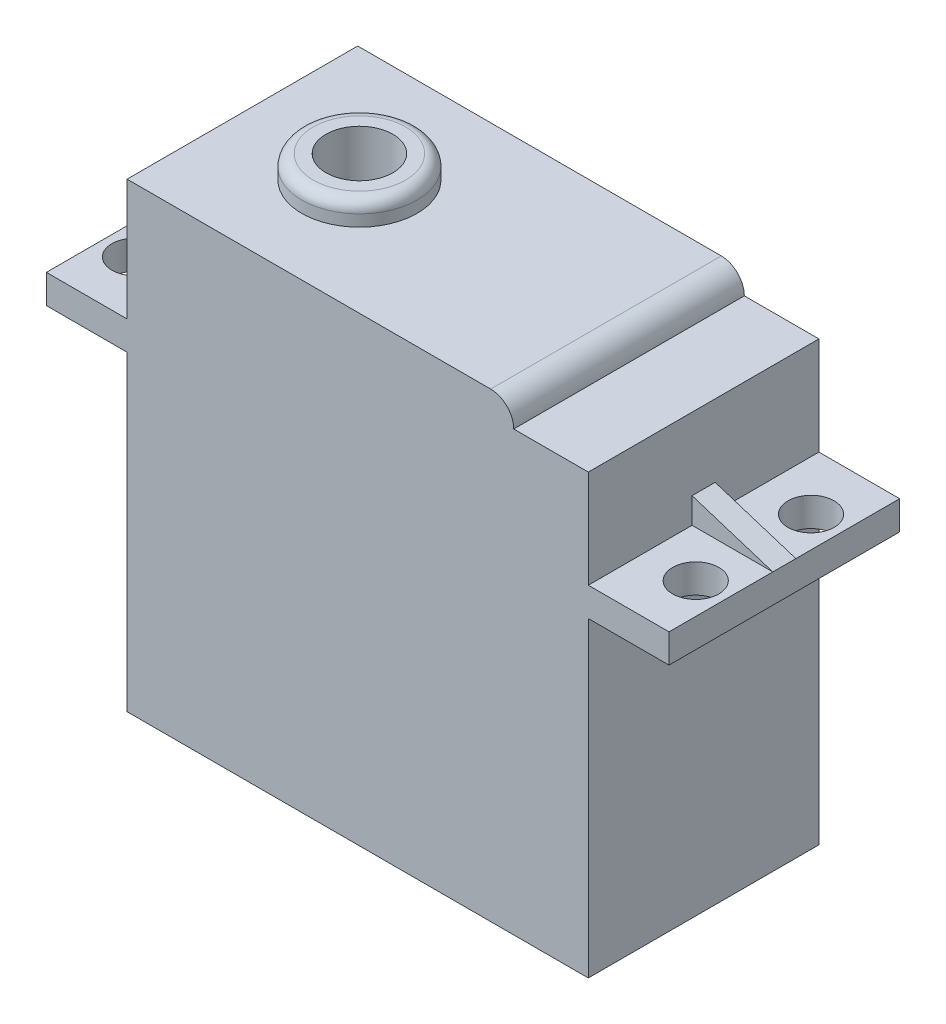
ISO-10303-21;
HEADER;
FILE_DESCRIPTION(('STEP AP214'),'2;1');
FILE_NAME('part.step','',(''),(''),'','','');
FILE_SCHEMA(('AUTOMOTIVE_DESIGN { 1 0 10303 214 1 1 1 1 }'));
ENDSEC;
DATA;
#1=APPLICATION_CONTEXT('core data for automotive mechanical design processes');
#2=APPLICATION_PROTOCOL_DEFINITION('international standard','automotive_design',2000,#1);
#3=PRODUCT_CONTEXT('',#1,'mechanical');
#4=PRODUCT('Part','Part','',(#3));
#5=PRODUCT_RELATED_PRODUCT_CATEGORY('part','',(#4));
#6=PRODUCT_DEFINITION_FORMATION('','',#4);
#7=PRODUCT_DEFINITION_CONTEXT('part definition',#1,'design');
#8=PRODUCT_DEFINITION('design','',#6,#7);
#9=PRODUCT_DEFINITION_SHAPE('','',#8);
#10=(LENGTH_UNIT() NAMED_UNIT(*) SI_UNIT(.MILLI.,.METRE.));
#11=(NAMED_UNIT(*) PLANE_ANGLE_UNIT() SI_UNIT($,.RADIAN.));
#12=(NAMED_UNIT(*) SI_UNIT($,.STERADIAN.) SOLID_ANGLE_UNIT());
#13=UNCERTAINTY_MEASURE_WITH_UNIT(LENGTH_MEASURE(1.E-05),#10,'distance_accuracy_value','');
#14=(GEOMETRIC_REPRESENTATION_CONTEXT(3) GLOBAL_UNCERTAINTY_ASSIGNED_CONTEXT((#13)) GLOBAL_UNIT_ASSIGNED_CONTEXT((#10,
#11,#12)) REPRESENTATION_CONTEXT('',''));
#15=CARTESIAN_POINT('',(0.,0.,0.));
#16=DIRECTION('',(0.,0.,1.));
#17=DIRECTION('',(1.,0.,0.));
#18=AXIS2_PLACEMENT_3D('',#15,#16,#17);
#19=CARTESIAN_POINT('',(0.,2.5,0.));
#20=DIRECTION('',(0.,-1.,0.));
#21=DIRECTION('',(0.,0.,-1.));
#22=AXIS2_PLACEMENT_3D('',#19,#20,#21);
#23=PLANE('',#22);
#24=CARTESIAN_POINT('',(24.315,2.5,-5.));
#25=DIRECTION('',(0.,1.,0.));
#26=DIRECTION('',(0.,0.,1.));
#27=AXIS2_PLACEMENT_3D('',#24,#25,#26);
#28=CIRCLE('',#27,2.);
#29=CARTESIAN_POINT('',(24.315,2.5,-3.));
#30=VERTEX_POINT('',#29);
#31=EDGE_CURVE('E264',#30,#30,#28,.T.);
#32=ORIENTED_EDGE('',*,*,#31,.F.);
#33=EDGE_LOOP('',(#32));
#34=FACE_BOUND('',#33,.T.);
#35=DIRECTION('',(-1.,0.,0.));
#36=VECTOR('',#35,1.);
#37=CARTESIAN_POINT('',(0.,2.5,-1.));
#38=LINE('',#37,#36);
#39=CARTESIAN_POINT('',(27.,2.5,-0.999999999999999));
#40=VERTEX_POINT('',#39);
#41=CARTESIAN_POINT('',(20.,2.5,-0.999999999999999));
#42=VERTEX_POINT('',#41);
#43=EDGE_CURVE('E53',#40,#42,#38,.T.);
#44=ORIENTED_EDGE('',*,*,#43,.F.);
#45=DIRECTION('',(0.,0.,-1.));
#46=VECTOR('',#45,1.);
#47=CARTESIAN_POINT('',(27.,2.5,-10.));
#48=LINE('',#47,#46);
#49=CARTESIAN_POINT('',(27.,2.5,-10.));
#50=VERTEX_POINT('',#49);
#51=EDGE_CURVE('E300',#40,#50,#48,.T.);
#52=ORIENTED_EDGE('',*,*,#51,.T.);
#53=DIRECTION('',(-1.,0.,0.));
#54=VECTOR('',#53,1.);
#55=CARTESIAN_POINT('',(-27.,2.5,-10.));
#56=LINE('',#55,#54);
#57=CARTESIAN_POINT('',(20.,2.5,-10.));
#58=VERTEX_POINT('',#57);
#59=EDGE_CURVE('E288',#50,#58,#56,.T.);
#60=ORIENTED_EDGE('',*,*,#59,.T.);
#61=DIRECTION('',(0.,0.,-1.));
#62=VECTOR('',#61,1.);
#63=CARTESIAN_POINT('',(20.,2.5,10.));
#64=LINE('',#63,#62);
#65=EDGE_CURVE('E250',#42,#58,#64,.T.);
#66=ORIENTED_EDGE('',*,*,#65,.F.);
#67=EDGE_LOOP('',(#44,#52,#60,#66));
#68=FACE_BOUND('',#67,.T.);
#69=ADVANCED_FACE('F38',(#34,#68),#23,.F.);
#70=CARTESIAN_POINT('',(-24.315,2.5,-5.));
#71=DIRECTION('',(0.,1.,0.));
#72=DIRECTION('',(0.,0.,-1.));
#73=AXIS2_PLACEMENT_3D('',#70,#71,#72);
#74=CIRCLE('',#73,2.);
#75=CARTESIAN_POINT('',(-24.315,2.5,-7.));
#76=VERTEX_POINT('',#75);
#77=EDGE_CURVE('E276',#76,#76,#74,.T.);
#78=ORIENTED_EDGE('',*,*,#77,.F.);
#79=EDGE_LOOP('',(#78));
#80=FACE_BOUND('',#79,.T.);
#81=DIRECTION('',(-1.,0.,0.));
#82=VECTOR('',#81,1.);
#83=CARTESIAN_POINT('',(0.,2.5,-1.));
#84=LINE('',#83,#82);
#85=CARTESIAN_POINT('',(-20.,2.5,-1.));
#86=VERTEX_POINT('',#85);
#87=CARTESIAN_POINT('',(-27.,2.5,-0.999999999999999));
#88=VERTEX_POINT('',#87);
#89=EDGE_CURVE('E206',#86,#88,#84,.T.);
#90=ORIENTED_EDGE('',*,*,#89,.F.);
#91=DIRECTION('',(0.,0.,1.));
#92=VECTOR('',#91,1.);
#93=CARTESIAN_POINT('',(-20.,2.5,-10.));
#94=LINE('',#93,#92);
#95=CARTESIAN_POINT('',(-20.,2.5,-10.));
#96=VERTEX_POINT('',#95);
#97=EDGE_CURVE('E248',#96,#86,#94,.T.);
#98=ORIENTED_EDGE('',*,*,#97,.F.);
#99=CARTESIAN_POINT('',(-27.,2.5,-10.));
#100=VERTEX_POINT('',#99);
#101=EDGE_CURVE('E292',#96,#100,#56,.T.);
#102=ORIENTED_EDGE('',*,*,#101,.T.);
#103=DIRECTION('',(0.,0.,1.));
#104=VECTOR('',#103,1.);
#105=CARTESIAN_POINT('',(-27.,2.5,10.));
#106=LINE('',#105,#104);
#107=EDGE_CURVE('E293',#100,#88,#106,.T.);
#108=ORIENTED_EDGE('',*,*,#107,.T.);
#109=EDGE_LOOP('',(#90,#98,#102,#108));
#110=FACE_BOUND('',#109,.T.);
#111=ADVANCED_FACE('F385',(#80,#110),#23,.F.);
#112=CARTESIAN_POINT('',(24.315,2.5,5.));
#113=DIRECTION('',(0.,1.,0.));
#114=DIRECTION('',(0.,0.,-1.));
#115=AXIS2_PLACEMENT_3D('',#112,#113,#114);
#116=CIRCLE('',#115,2.);
#117=CARTESIAN_POINT('',(24.315,2.5,3.));
#118=VERTEX_POINT('',#117);
#119=EDGE_CURVE('E270',#118,#118,#116,.T.);
#120=ORIENTED_EDGE('',*,*,#119,.F.);
#121=EDGE_LOOP('',(#120));
#122=FACE_BOUND('',#121,.T.);
#123=CARTESIAN_POINT('',(27.,2.5,10.));
#124=VERTEX_POINT('',#123);
#125=CARTESIAN_POINT('',(27.,2.5,0.999999999999999));
#126=VERTEX_POINT('',#125);
#127=EDGE_CURVE('E301',#124,#126,#48,.T.);
#128=ORIENTED_EDGE('',*,*,#127,.T.);
#129=DIRECTION('',(-1.,0.,0.));
#130=VECTOR('',#129,1.);
#131=CARTESIAN_POINT('',(0.,2.5,1.));
#132=LINE('',#131,#130);
#133=CARTESIAN_POINT('',(20.,2.5,0.999999999999999));
#134=VERTEX_POINT('',#133);
#135=EDGE_CURVE('E61',#126,#134,#132,.T.);
#136=ORIENTED_EDGE('',*,*,#135,.T.);
#137=CARTESIAN_POINT('',(20.,2.5,10.));
#138=VERTEX_POINT('',#137);
#139=EDGE_CURVE('E243',#138,#134,#64,.T.);
#140=ORIENTED_EDGE('',*,*,#139,.F.);
#141=DIRECTION('',(1.,0.,0.));
#142=VECTOR('',#141,1.);
#143=CARTESIAN_POINT('',(27.,2.5,10.));
#144=LINE('',#143,#142);
#145=EDGE_CURVE('E296',#138,#124,#144,.T.);
#146=ORIENTED_EDGE('',*,*,#145,.T.);
#147=EDGE_LOOP('',(#128,#136,#140,#146));
#148=FACE_BOUND('',#147,.T.);
#149=ADVANCED_FACE('F388',(#122,#148),#23,.F.);
#150=CARTESIAN_POINT('',(-24.315,2.5,5.));
#151=DIRECTION('',(0.,1.,0.));
#152=DIRECTION('',(0.,0.,1.));
#153=AXIS2_PLACEMENT_3D('',#150,#151,#152);
#154=CIRCLE('',#153,2.);
#155=CARTESIAN_POINT('',(-24.315,2.5,7.));
#156=VERTEX_POINT('',#155);
#157=EDGE_CURVE('E282',#156,#156,#154,.T.);
#158=ORIENTED_EDGE('',*,*,#157,.F.);
#159=EDGE_LOOP('',(#158));
#160=FACE_BOUND('',#159,.T.);
#161=CARTESIAN_POINT('',(-20.,2.5,0.999999999999999));
#162=VERTEX_POINT('',#161);
#163=CARTESIAN_POINT('',(-20.,2.5,10.));
#164=VERTEX_POINT('',#163);
#165=EDGE_CURVE('E237',#162,#164,#94,.T.);
#166=ORIENTED_EDGE('',*,*,#165,.F.);
#167=DIRECTION('',(-1.,0.,0.));
#168=VECTOR('',#167,1.);
#169=CARTESIAN_POINT('',(0.,2.5,1.));
#170=LINE('',#169,#168);
#171=CARTESIAN_POINT('',(-27.,2.5,0.999999999999999));
#172=VERTEX_POINT('',#171);
#173=EDGE_CURVE('E214',#162,#172,#170,.T.);
#174=ORIENTED_EDGE('',*,*,#173,.T.);
#175=CARTESIAN_POINT('',(-27.,2.5,10.));
#176=VERTEX_POINT('',#175);
#177=EDGE_CURVE('E291',#172,#176,#106,.T.);
#178=ORIENTED_EDGE('',*,*,#177,.T.);
#179=EDGE_CURVE('E297',#176,#164,#144,.T.);
#180=ORIENTED_EDGE('',*,*,#179,.T.);
#181=EDGE_LOOP('',(#166,#174,#178,#180));
#182=FACE_BOUND('',#181,.T.);
#183=ADVANCED_FACE('F393',(#160,#182),#23,.F.);
#184=CARTESIAN_POINT('',(0.,-27.,10.));
#185=DIRECTION('',(0.,0.,1.));
#186=DIRECTION('',(1.,0.,0.));
#187=AXIS2_PLACEMENT_3D('',#184,#185,#186);
#188=PLANE('',#187);
#189=DIRECTION('',(1.,0.,0.));
#190=VECTOR('',#189,1.);
#191=CARTESIAN_POINT('',(-20.,11.,10.));
#192=LINE('',#191,#190);
#193=CARTESIAN_POINT('',(13.5311118888266,11.,10.));
#194=VERTEX_POINT('',#193);
#195=CARTESIAN_POINT('',(20.,11.,10.));
#196=VERTEX_POINT('',#195);
#197=EDGE_CURVE('E242',#194,#196,#192,.T.);
#198=ORIENTED_EDGE('',*,*,#197,.F.);
#199=CARTESIAN_POINT('',(11.5311118888266,11.,10.));
#200=DIRECTION('',(0.,0.,1.));
#201=DIRECTION('',(1.,0.,0.));
#202=AXIS2_PLACEMENT_3D('',#199,#200,#201);
#203=CIRCLE('',#202,2.);
#204=CARTESIAN_POINT('',(11.5311118888266,13.,10.));
#205=VERTEX_POINT('',#204);
#206=EDGE_CURVE('E356',#194,#205,#203,.T.);
#207=ORIENTED_EDGE('',*,*,#206,.T.);
#208=DIRECTION('',(1.,0.,0.));
#209=VECTOR('',#208,1.);
#210=CARTESIAN_POINT('',(13.5311118888266,13.,10.));
#211=LINE('',#210,#209);
#212=CARTESIAN_POINT('',(-20.,13.,10.));
#213=VERTEX_POINT('',#212);
#214=EDGE_CURVE('E232',#213,#205,#211,.T.);
#215=ORIENTED_EDGE('',*,*,#214,.F.);
#216=DIRECTION('',(0.,-1.,0.));
#217=VECTOR('',#216,1.);
#218=CARTESIAN_POINT('',(-20.,11.,10.));
#219=LINE('',#218,#217);
#220=EDGE_CURVE('E257',#213,#164,#219,.T.);
#221=ORIENTED_EDGE('',*,*,#220,.T.);
#222=ORIENTED_EDGE('',*,*,#179,.F.);
#223=DIRECTION('',(0.,-1.,0.));
#224=VECTOR('',#223,1.);
#225=CARTESIAN_POINT('',(-27.,2.5,10.));
#226=LINE('',#225,#224);
#227=CARTESIAN_POINT('',(-27.,0.,10.));
#228=VERTEX_POINT('',#227);
#229=EDGE_CURVE('E321',#176,#228,#226,.T.);
#230=ORIENTED_EDGE('',*,*,#229,.T.);
#231=DIRECTION('',(1.,0.,0.));
#232=VECTOR('',#231,1.);
#233=CARTESIAN_POINT('',(27.,0.,10.));
#234=LINE('',#233,#232);
#235=CARTESIAN_POINT('',(-20.,0.,10.));
#236=VERTEX_POINT('',#235);
#237=EDGE_CURVE('E307',#228,#236,#234,.T.);
#238=ORIENTED_EDGE('',*,*,#237,.T.);
#239=DIRECTION('',(0.,1.,0.));
#240=VECTOR('',#239,1.);
#241=CARTESIAN_POINT('',(-20.,-27.,10.));
#242=LINE('',#241,#240);
#243=CARTESIAN_POINT('',(-20.,-27.,10.));
#244=VERTEX_POINT('',#243);
#245=EDGE_CURVE('E342',#244,#236,#242,.T.);
#246=ORIENTED_EDGE('',*,*,#245,.F.);
#247=DIRECTION('',(1.,0.,0.));
#248=VECTOR('',#247,1.);
#249=CARTESIAN_POINT('',(20.,-27.,10.));
#250=LINE('',#249,#248);
#251=CARTESIAN_POINT('',(20.,-27.,10.));
#252=VERTEX_POINT('',#251);
#253=EDGE_CURVE('E328',#244,#252,#250,.T.);
#254=ORIENTED_EDGE('',*,*,#253,.T.);
#255=DIRECTION('',(0.,1.,0.));
#256=VECTOR('',#255,1.);
#257=CARTESIAN_POINT('',(20.,-27.,10.));
#258=LINE('',#257,#256);
#259=CARTESIAN_POINT('',(20.,0.,10.));
#260=VERTEX_POINT('',#259);
#261=EDGE_CURVE('E339',#252,#260,#258,.T.);
#262=ORIENTED_EDGE('',*,*,#261,.T.);
#263=CARTESIAN_POINT('',(27.,0.,10.));
#264=VERTEX_POINT('',#263);
#265=EDGE_CURVE('E306',#260,#264,#234,.T.);
#266=ORIENTED_EDGE('',*,*,#265,.T.);
#267=DIRECTION('',(0.,-1.,0.));
#268=VECTOR('',#267,1.);
#269=CARTESIAN_POINT('',(27.,2.5,10.));
#270=LINE('',#269,#268);
#271=EDGE_CURVE('E318',#124,#264,#270,.T.);
#272=ORIENTED_EDGE('',*,*,#271,.F.);
#273=ORIENTED_EDGE('',*,*,#145,.F.);
#274=DIRECTION('',(0.,-1.,0.));
#275=VECTOR('',#274,1.);
#276=CARTESIAN_POINT('',(20.,11.,10.));
#277=LINE('',#276,#275);
#278=EDGE_CURVE('E254',#196,#138,#277,.T.);
#279=ORIENTED_EDGE('',*,*,#278,.F.);
#280=EDGE_LOOP('',(#198,#207,#215,#221,#222,#230,#238,#246,#254,#262,#266,#272,#273,#279));
#281=FACE_BOUND('',#280,.T.);
#282=ADVANCED_FACE('F402',(#281),#188,.T.);
#283=CARTESIAN_POINT('',(-20.,-27.,10.));
#284=DIRECTION('',(-1.,0.,0.));
#285=DIRECTION('',(0.,0.,1.));
#286=AXIS2_PLACEMENT_3D('',#283,#284,#285);
#287=PLANE('',#286);
#288=ORIENTED_EDGE('',*,*,#245,.T.);
#289=DIRECTION('',(0.,0.,1.));
#290=VECTOR('',#289,1.);
#291=CARTESIAN_POINT('',(-20.,0.,10.));
#292=LINE('',#291,#290);
#293=CARTESIAN_POINT('',(-20.,0.,-10.));
#294=VERTEX_POINT('',#293);
#295=EDGE_CURVE('E332',#294,#236,#292,.T.);
#296=ORIENTED_EDGE('',*,*,#295,.F.);
#297=DIRECTION('',(0.,1.,0.));
#298=VECTOR('',#297,1.);
#299=CARTESIAN_POINT('',(-20.,-27.,-10.));
#300=LINE('',#299,#298);
#301=CARTESIAN_POINT('',(-20.,-27.,-10.));
#302=VERTEX_POINT('',#301);
#303=EDGE_CURVE('E346',#302,#294,#300,.T.);
#304=ORIENTED_EDGE('',*,*,#303,.F.);
#305=DIRECTION('',(0.,0.,1.));
#306=VECTOR('',#305,1.);
#307=CARTESIAN_POINT('',(-20.,-27.,10.));
#308=LINE('',#307,#306);
#309=EDGE_CURVE('E337',#302,#244,#308,.T.);
#310=ORIENTED_EDGE('',*,*,#309,.T.);
#311=EDGE_LOOP('',(#288,#296,#304,#310));
#312=FACE_BOUND('',#311,.T.);
#313=ADVANCED_FACE('F551',(#312),#287,.T.);
#314=CARTESIAN_POINT('',(-20.,-27.,-10.));
#315=DIRECTION('',(0.,0.,-1.));
#316=DIRECTION('',(-1.,0.,0.));
#317=AXIS2_PLACEMENT_3D('',#314,#315,#316);
#318=PLANE('',#317);
#319=DIRECTION('',(-1.,0.,0.));
#320=VECTOR('',#319,1.);
#321=CARTESIAN_POINT('',(-20.,13.,-10.));
#322=LINE('',#321,#320);
#323=CARTESIAN_POINT('',(11.5311118888266,13.,-10.));
#324=VERTEX_POINT('',#323);
#325=CARTESIAN_POINT('',(-20.,13.,-10.));
#326=VERTEX_POINT('',#325);
#327=EDGE_CURVE('E235',#324,#326,#322,.T.);
#328=ORIENTED_EDGE('',*,*,#327,.F.);
#329=CARTESIAN_POINT('',(11.5311118888266,11.,-10.));
#330=DIRECTION('',(0.,0.,-1.));
#331=DIRECTION('',(-1.,0.,0.));
#332=AXIS2_PLACEMENT_3D('',#329,#330,#331);
#333=CIRCLE('',#332,2.);
#334=CARTESIAN_POINT('',(13.5311118888266,11.,-10.));
#335=VERTEX_POINT('',#334);
#336=EDGE_CURVE('E353',#324,#335,#333,.T.);
#337=ORIENTED_EDGE('',*,*,#336,.T.);
#338=DIRECTION('',(-1.,0.,0.));
#339=VECTOR('',#338,1.);
#340=CARTESIAN_POINT('',(20.,11.,-10.));
#341=LINE('',#340,#339);
#342=CARTESIAN_POINT('',(20.,11.,-10.));
#343=VERTEX_POINT('',#342);
#344=EDGE_CURVE('E239',#343,#335,#341,.T.);
#345=ORIENTED_EDGE('',*,*,#344,.F.);
#346=DIRECTION('',(0.,-1.,0.));
#347=VECTOR('',#346,1.);
#348=CARTESIAN_POINT('',(20.,11.,-10.));
#349=LINE('',#348,#347);
#350=EDGE_CURVE('E247',#343,#58,#349,.T.);
#351=ORIENTED_EDGE('',*,*,#350,.T.);
#352=ORIENTED_EDGE('',*,*,#59,.F.);
#353=DIRECTION('',(0.,-1.,0.));
#354=VECTOR('',#353,1.);
#355=CARTESIAN_POINT('',(27.,2.5,-10.));
#356=LINE('',#355,#354);
#357=CARTESIAN_POINT('',(27.,0.,-10.));
#358=VERTEX_POINT('',#357);
#359=EDGE_CURVE('E304',#50,#358,#356,.T.);
#360=ORIENTED_EDGE('',*,*,#359,.T.);
#361=DIRECTION('',(-1.,0.,0.));
#362=VECTOR('',#361,1.);
#363=CARTESIAN_POINT('',(0.,0.,-10.));
#364=LINE('',#363,#362);
#365=CARTESIAN_POINT('',(20.,0.,-10.));
#366=VERTEX_POINT('',#365);
#367=EDGE_CURVE('E313',#358,#366,#364,.T.);
#368=ORIENTED_EDGE('',*,*,#367,.T.);
#369=DIRECTION('',(0.,1.,0.));
#370=VECTOR('',#369,1.);
#371=CARTESIAN_POINT('',(20.,-27.,-10.));
#372=LINE('',#371,#370);
#373=CARTESIAN_POINT('',(20.,-27.,-10.));
#374=VERTEX_POINT('',#373);
#375=EDGE_CURVE('E348',#374,#366,#372,.T.);
#376=ORIENTED_EDGE('',*,*,#375,.F.);
#377=DIRECTION('',(-1.,0.,0.));
#378=VECTOR('',#377,1.);
#379=CARTESIAN_POINT('',(-20.,-27.,-10.));
#380=LINE('',#379,#378);
#381=EDGE_CURVE('E334',#374,#302,#380,.T.);
#382=ORIENTED_EDGE('',*,*,#381,.T.);
#383=ORIENTED_EDGE('',*,*,#303,.T.);
#384=CARTESIAN_POINT('',(-27.,0.,-10.));
#385=VERTEX_POINT('',#384);
#386=EDGE_CURVE('E312',#294,#385,#364,.T.);
#387=ORIENTED_EDGE('',*,*,#386,.T.);
#388=DIRECTION('',(0.,-1.,0.));
#389=VECTOR('',#388,1.);
#390=CARTESIAN_POINT('',(-27.,2.5,-10.));
#391=LINE('',#390,#389);
#392=EDGE_CURVE('E324',#100,#385,#391,.T.);
#393=ORIENTED_EDGE('',*,*,#392,.F.);
#394=ORIENTED_EDGE('',*,*,#101,.F.);
#395=DIRECTION('',(0.,-1.,0.));
#396=VECTOR('',#395,1.);
#397=CARTESIAN_POINT('',(-20.,11.,-10.));
#398=LINE('',#397,#396);
#399=EDGE_CURVE('E260',#326,#96,#398,.T.);
#400=ORIENTED_EDGE('',*,*,#399,.F.);
#401=EDGE_LOOP('',(#328,#337,#345,#351,#352,#360,#368,#376,#382,#383,#387,#393,#394,#400));
#402=FACE_BOUND('',#401,.T.);
#403=ADVANCED_FACE('F545',(#402),#318,.T.);
#404=CARTESIAN_POINT('',(20.,-27.,-10.));
#405=DIRECTION('',(1.,0.,0.));
#406=DIRECTION('',(0.,0.,-1.));
#407=AXIS2_PLACEMENT_3D('',#404,#405,#406);
#408=PLANE('',#407);
#409=DIRECTION('',(0.,0.,-1.));
#410=VECTOR('',#409,1.);
#411=CARTESIAN_POINT('',(20.,-27.,-10.));
#412=LINE('',#411,#410);
#413=EDGE_CURVE('E331',#252,#374,#412,.T.);
#414=ORIENTED_EDGE('',*,*,#413,.T.);
#415=ORIENTED_EDGE('',*,*,#375,.T.);
#416=DIRECTION('',(0.,0.,-1.));
#417=VECTOR('',#416,1.);
#418=CARTESIAN_POINT('',(20.,0.,-10.));
#419=LINE('',#418,#417);
#420=EDGE_CURVE('E327',#260,#366,#419,.T.);
#421=ORIENTED_EDGE('',*,*,#420,.F.);
#422=ORIENTED_EDGE('',*,*,#261,.F.);
#423=EDGE_LOOP('',(#414,#415,#421,#422));
#424=FACE_BOUND('',#423,.T.);
#425=ADVANCED_FACE('F550',(#424),#408,.T.);
#426=CARTESIAN_POINT('',(0.,-27.,0.));
#427=DIRECTION('',(0.,-1.,0.));
#428=DIRECTION('',(0.,0.,-1.));
#429=AXIS2_PLACEMENT_3D('',#426,#427,#428);
#430=PLANE('',#429);
#431=ORIENTED_EDGE('',*,*,#253,.F.);
#432=ORIENTED_EDGE('',*,*,#309,.F.);
#433=ORIENTED_EDGE('',*,*,#381,.F.);
#434=ORIENTED_EDGE('',*,*,#413,.F.);
#435=EDGE_LOOP('',(#431,#432,#433,#434));
#436=FACE_BOUND('',#435,.T.);
#437=ADVANCED_FACE('F643',(#436),#430,.T.);
#438=CARTESIAN_POINT('',(0.,0.,0.));
#439=DIRECTION('',(0.,-1.,0.));
#440=DIRECTION('',(0.,0.,-1.));
#441=AXIS2_PLACEMENT_3D('',#438,#439,#440);
#442=PLANE('',#441);
#443=ORIENTED_EDGE('',*,*,#367,.F.);
#444=DIRECTION('',(0.,0.,-1.));
#445=VECTOR('',#444,1.);
#446=CARTESIAN_POINT('',(27.,0.,-10.));
#447=LINE('',#446,#445);
#448=EDGE_CURVE('E310',#264,#358,#447,.T.);
#449=ORIENTED_EDGE('',*,*,#448,.F.);
#450=ORIENTED_EDGE('',*,*,#265,.F.);
#451=ORIENTED_EDGE('',*,*,#420,.T.);
#452=EDGE_LOOP('',(#443,#449,#450,#451));
#453=FACE_BOUND('',#452,.T.);
#454=CARTESIAN_POINT('',(24.315,0.,5.));
#455=DIRECTION('',(0.,1.,0.));
#456=DIRECTION('',(0.,0.,-1.));
#457=AXIS2_PLACEMENT_3D('',#454,#455,#456);
#458=CIRCLE('',#457,2.);
#459=CARTESIAN_POINT('',(24.315,0.,3.));
#460=VERTEX_POINT('',#459);
#461=EDGE_CURVE('E267',#460,#460,#458,.T.);
#462=ORIENTED_EDGE('',*,*,#461,.T.);
#463=EDGE_LOOP('',(#462));
#464=FACE_BOUND('',#463,.T.);
#465=CARTESIAN_POINT('',(24.315,0.,-5.));
#466=DIRECTION('',(0.,1.,0.));
#467=DIRECTION('',(0.,0.,1.));
#468=AXIS2_PLACEMENT_3D('',#465,#466,#467);
#469=CIRCLE('',#468,2.);
#470=CARTESIAN_POINT('',(24.315,0.,-3.));
#471=VERTEX_POINT('',#470);
#472=EDGE_CURVE('E263',#471,#471,#469,.T.);
#473=ORIENTED_EDGE('',*,*,#472,.T.);
#474=EDGE_LOOP('',(#473));
#475=FACE_BOUND('',#474,.T.);
#476=ADVANCED_FACE('F636',(#453,#464,#475),#442,.T.);
#477=ORIENTED_EDGE('',*,*,#237,.F.);
#478=DIRECTION('',(0.,0.,1.));
#479=VECTOR('',#478,1.);
#480=CARTESIAN_POINT('',(-27.,0.,10.));
#481=LINE('',#480,#479);
#482=EDGE_CURVE('E285',#385,#228,#481,.T.);
#483=ORIENTED_EDGE('',*,*,#482,.F.);
#484=ORIENTED_EDGE('',*,*,#386,.F.);
#485=ORIENTED_EDGE('',*,*,#295,.T.);
#486=EDGE_LOOP('',(#477,#483,#484,#485));
#487=FACE_BOUND('',#486,.T.);
#488=CARTESIAN_POINT('',(-24.315,0.,5.));
#489=DIRECTION('',(0.,1.,0.));
#490=DIRECTION('',(0.,0.,1.));
#491=AXIS2_PLACEMENT_3D('',#488,#489,#490);
#492=CIRCLE('',#491,2.);
#493=CARTESIAN_POINT('',(-24.315,0.,7.));
#494=VERTEX_POINT('',#493);
#495=EDGE_CURVE('E279',#494,#494,#492,.T.);
#496=ORIENTED_EDGE('',*,*,#495,.T.);
#497=EDGE_LOOP('',(#496));
#498=FACE_BOUND('',#497,.T.);
#499=CARTESIAN_POINT('',(-24.315,0.,-5.));
#500=DIRECTION('',(0.,1.,0.));
#501=DIRECTION('',(0.,0.,-1.));
#502=AXIS2_PLACEMENT_3D('',#499,#500,#501);
#503=CIRCLE('',#502,2.);
#504=CARTESIAN_POINT('',(-24.315,0.,-7.));
#505=VERTEX_POINT('',#504);
#506=EDGE_CURVE('E273',#505,#505,#503,.T.);
#507=ORIENTED_EDGE('',*,*,#506,.T.);
#508=EDGE_LOOP('',(#507));
#509=FACE_BOUND('',#508,.T.);
#510=ADVANCED_FACE('F628',(#487,#498,#509),#442,.T.);
#511=CARTESIAN_POINT('',(-27.,2.5,10.));
#512=DIRECTION('',(1.,0.,0.));
#513=DIRECTION('',(0.,0.,-1.));
#514=AXIS2_PLACEMENT_3D('',#511,#512,#513);
#515=PLANE('',#514);
#516=ORIENTED_EDGE('',*,*,#177,.F.);
#517=DIRECTION('',(0.,0.,-1.));
#518=VECTOR('',#517,1.);
#519=CARTESIAN_POINT('',(-27.,2.5,10.));
#520=LINE('',#519,#518);
#521=EDGE_CURVE('E220',#88,#172,#520,.F.);
#522=ORIENTED_EDGE('',*,*,#521,.F.);
#523=ORIENTED_EDGE('',*,*,#107,.F.);
#524=ORIENTED_EDGE('',*,*,#392,.T.);
#525=ORIENTED_EDGE('',*,*,#482,.T.);
#526=ORIENTED_EDGE('',*,*,#229,.F.);
#527=EDGE_LOOP('',(#516,#522,#523,#524,#525,#526));
#528=FACE_BOUND('',#527,.T.);
#529=ADVANCED_FACE('F621',(#528),#515,.F.);
#530=CARTESIAN_POINT('',(27.,2.5,-10.));
#531=DIRECTION('',(-1.,0.,0.));
#532=DIRECTION('',(0.,0.,1.));
#533=AXIS2_PLACEMENT_3D('',#530,#531,#532);
#534=PLANE('',#533);
#535=ORIENTED_EDGE('',*,*,#448,.T.);
#536=ORIENTED_EDGE('',*,*,#359,.F.);
#537=ORIENTED_EDGE('',*,*,#51,.F.);
#538=DIRECTION('',(0.,0.,-1.));
#539=VECTOR('',#538,1.);
#540=CARTESIAN_POINT('',(27.,2.5,-10.));
#541=LINE('',#540,#539);
#542=EDGE_CURVE('E185',#126,#40,#541,.T.);
#543=ORIENTED_EDGE('',*,*,#542,.F.);
#544=ORIENTED_EDGE('',*,*,#127,.F.);
#545=ORIENTED_EDGE('',*,*,#271,.T.);
#546=EDGE_LOOP('',(#535,#536,#537,#543,#544,#545));
#547=FACE_BOUND('',#546,.T.);
#548=ADVANCED_FACE('F615',(#547),#534,.F.);
#549=CARTESIAN_POINT('',(-24.315,2.5,5.));
#550=DIRECTION('',(0.,-1.,0.));
#551=DIRECTION('',(0.,0.,-1.));
#552=AXIS2_PLACEMENT_3D('',#549,#550,#551);
#553=CYLINDRICAL_SURFACE('',#552,2.);
#554=ORIENTED_EDGE('',*,*,#157,.T.);
#555=EDGE_LOOP('',(#554));
#556=FACE_BOUND('',#555,.T.);
#557=ORIENTED_EDGE('',*,*,#495,.F.);
#558=EDGE_LOOP('',(#557));
#559=FACE_BOUND('',#558,.T.);
#560=ADVANCED_FACE('F607',(#556,#559),#553,.F.);
#561=CARTESIAN_POINT('',(-24.315,2.5,-5.));
#562=DIRECTION('',(0.,-1.,0.));
#563=DIRECTION('',(0.,0.,-1.));
#564=AXIS2_PLACEMENT_3D('',#561,#562,#563);
#565=CYLINDRICAL_SURFACE('',#564,2.);
#566=ORIENTED_EDGE('',*,*,#77,.T.);
#567=EDGE_LOOP('',(#566));
#568=FACE_BOUND('',#567,.T.);
#569=ORIENTED_EDGE('',*,*,#506,.F.);
#570=EDGE_LOOP('',(#569));
#571=FACE_BOUND('',#570,.T.);
#572=ADVANCED_FACE('F599',(#568,#571),#565,.F.);
#573=CARTESIAN_POINT('',(24.315,2.5,5.));
#574=DIRECTION('',(0.,-1.,0.));
#575=DIRECTION('',(0.,0.,-1.));
#576=AXIS2_PLACEMENT_3D('',#573,#574,#575);
#577=CYLINDRICAL_SURFACE('',#576,2.);
#578=ORIENTED_EDGE('',*,*,#119,.T.);
#579=EDGE_LOOP('',(#578));
#580=FACE_BOUND('',#579,.T.);
#581=ORIENTED_EDGE('',*,*,#461,.F.);
#582=EDGE_LOOP('',(#581));
#583=FACE_BOUND('',#582,.T.);
#584=ADVANCED_FACE('F591',(#580,#583),#577,.F.);
#585=CARTESIAN_POINT('',(24.315,2.5,-5.));
#586=DIRECTION('',(0.,-1.,0.));
#587=DIRECTION('',(0.,0.,-1.));
#588=AXIS2_PLACEMENT_3D('',#585,#586,#587);
#589=CYLINDRICAL_SURFACE('',#588,2.);
#590=ORIENTED_EDGE('',*,*,#31,.T.);
#591=EDGE_LOOP('',(#590));
#592=FACE_BOUND('',#591,.T.);
#593=ORIENTED_EDGE('',*,*,#472,.F.);
#594=EDGE_LOOP('',(#593));
#595=FACE_BOUND('',#594,.T.);
#596=ADVANCED_FACE('F536',(#592,#595),#589,.F.);
#597=CARTESIAN_POINT('',(-20.,11.,-10.));
#598=DIRECTION('',(1.,0.,0.));
#599=DIRECTION('',(0.,0.,-1.));
#600=AXIS2_PLACEMENT_3D('',#597,#598,#599);
#601=PLANE('',#600);
#602=ORIENTED_EDGE('',*,*,#220,.F.);
#603=DIRECTION('',(0.,0.,1.));
#604=VECTOR('',#603,1.);
#605=CARTESIAN_POINT('',(-20.,13.,10.));
#606=LINE('',#605,#604);
#607=EDGE_CURVE('E230',#326,#213,#606,.T.);
#608=ORIENTED_EDGE('',*,*,#607,.F.);
#609=ORIENTED_EDGE('',*,*,#399,.T.);
#610=ORIENTED_EDGE('',*,*,#97,.T.);
#611=DIRECTION('',(0.,-1.,0.));
#612=VECTOR('',#611,1.);
#613=CARTESIAN_POINT('',(-20.,11.,-0.999999999999999));
#614=LINE('',#613,#612);
#615=CARTESIAN_POINT('',(-20.,4.72629267572029,-1.));
#616=VERTEX_POINT('',#615);
#617=EDGE_CURVE('E211',#616,#86,#614,.T.);
#618=ORIENTED_EDGE('',*,*,#617,.F.);
#619=DIRECTION('',(0.,0.,-1.));
#620=VECTOR('',#619,1.);
#621=CARTESIAN_POINT('',(-20.,4.72629267572029,-10.));
#622=LINE('',#621,#620);
#623=CARTESIAN_POINT('',(-20.,4.72629267572029,1.));
#624=VERTEX_POINT('',#623);
#625=EDGE_CURVE('E218',#616,#624,#622,.F.);
#626=ORIENTED_EDGE('',*,*,#625,.T.);
#627=DIRECTION('',(0.,-1.,0.));
#628=VECTOR('',#627,1.);
#629=CARTESIAN_POINT('',(-20.,11.,0.999999999999999));
#630=LINE('',#629,#628);
#631=EDGE_CURVE('E216',#624,#162,#630,.T.);
#632=ORIENTED_EDGE('',*,*,#631,.T.);
#633=ORIENTED_EDGE('',*,*,#165,.T.);
#634=EDGE_LOOP('',(#602,#608,#609,#610,#618,#626,#632,#633));
#635=FACE_BOUND('',#634,.T.);
#636=ADVANCED_FACE('F529',(#635),#601,.F.);
#637=CARTESIAN_POINT('',(20.,11.,10.));
#638=DIRECTION('',(-1.,0.,0.));
#639=DIRECTION('',(0.,0.,1.));
#640=AXIS2_PLACEMENT_3D('',#637,#638,#639);
#641=PLANE('',#640);
#642=ORIENTED_EDGE('',*,*,#139,.T.);
#643=DIRECTION('',(0.,1.,0.));
#644=VECTOR('',#643,1.);
#645=CARTESIAN_POINT('',(20.,11.,0.999999999999999));
#646=LINE('',#645,#644);
#647=CARTESIAN_POINT('',(20.,4.72629267572029,1.));
#648=VERTEX_POINT('',#647);
#649=EDGE_CURVE('E181',#134,#648,#646,.T.);
#650=ORIENTED_EDGE('',*,*,#649,.T.);
#651=DIRECTION('',(0.,0.,-1.));
#652=VECTOR('',#651,1.);
#653=CARTESIAN_POINT('',(20.,4.72629267572029,10.));
#654=LINE('',#653,#652);
#655=CARTESIAN_POINT('',(20.,4.72629267572029,-1.));
#656=VERTEX_POINT('',#655);
#657=EDGE_CURVE('E176',#648,#656,#654,.T.);
#658=ORIENTED_EDGE('',*,*,#657,.T.);
#659=DIRECTION('',(0.,1.,0.));
#660=VECTOR('',#659,1.);
#661=CARTESIAN_POINT('',(20.,11.,-0.999999999999999));
#662=LINE('',#661,#660);
#663=EDGE_CURVE('E180',#42,#656,#662,.T.);
#664=ORIENTED_EDGE('',*,*,#663,.F.);
#665=ORIENTED_EDGE('',*,*,#65,.T.);
#666=ORIENTED_EDGE('',*,*,#350,.F.);
#667=DIRECTION('',(0.,0.,-1.));
#668=VECTOR('',#667,1.);
#669=CARTESIAN_POINT('',(20.,11.,10.));
#670=LINE('',#669,#668);
#671=EDGE_CURVE('E245',#196,#343,#670,.T.);
#672=ORIENTED_EDGE('',*,*,#671,.F.);
#673=ORIENTED_EDGE('',*,*,#278,.T.);
#674=EDGE_LOOP('',(#642,#650,#658,#664,#665,#666,#672,#673));
#675=FACE_BOUND('',#674,.T.);
#676=ADVANCED_FACE('F179',(#675),#641,.F.);
#677=CARTESIAN_POINT('',(0.,11.,0.));
#678=DIRECTION('',(0.,1.,0.));
#679=DIRECTION('',(0.,0.,1.));
#680=AXIS2_PLACEMENT_3D('',#677,#678,#679);
#681=PLANE('',#680);
#682=ORIENTED_EDGE('',*,*,#671,.T.);
#683=ORIENTED_EDGE('',*,*,#344,.T.);
#684=DIRECTION('',(0.,0.,-1.));
#685=VECTOR('',#684,1.);
#686=CARTESIAN_POINT('',(13.5311118888266,11.,-10.));
#687=LINE('',#686,#685);
#688=EDGE_CURVE('E227',#194,#335,#687,.T.);
#689=ORIENTED_EDGE('',*,*,#688,.F.);
#690=ORIENTED_EDGE('',*,*,#197,.T.);
#691=EDGE_LOOP('',(#682,#683,#689,#690));
#692=FACE_BOUND('',#691,.T.);
#693=ADVANCED_FACE('F525',(#692),#681,.T.);
#694=CARTESIAN_POINT('',(0.,13.,0.));
#695=DIRECTION('',(0.,-1.,0.));
#696=DIRECTION('',(0.,0.,-1.));
#697=AXIS2_PLACEMENT_3D('',#694,#695,#696);
#698=PLANE('',#697);
#699=ORIENTED_EDGE('',*,*,#607,.T.);
#700=ORIENTED_EDGE('',*,*,#214,.T.);
#701=DIRECTION('',(0.,0.,-1.));
#702=VECTOR('',#701,1.);
#703=CARTESIAN_POINT('',(11.5311118888266,13.,0.));
#704=LINE('',#703,#702);
#705=EDGE_CURVE('E345',#205,#324,#704,.T.);
#706=ORIENTED_EDGE('',*,*,#705,.T.);
#707=ORIENTED_EDGE('',*,*,#327,.T.);
#708=EDGE_LOOP('',(#699,#700,#706,#707));
#709=FACE_BOUND('',#708,.T.);
#710=CARTESIAN_POINT('',(-9.85,13.,0.));
#711=DIRECTION('',(0.,-1.,0.));
#712=DIRECTION('',(0.,0.,-1.));
#713=AXIS2_PLACEMENT_3D('',#710,#711,#712);
#714=CIRCLE('',#713,5.);
#715=CARTESIAN_POINT('',(-9.85,13.,-5.));
#716=VERTEX_POINT('',#715);
#717=EDGE_CURVE('E358',#716,#716,#714,.F.);
#718=ORIENTED_EDGE('',*,*,#717,.F.);
#719=EDGE_LOOP('',(#718));
#720=FACE_BOUND('',#719,.T.);
#721=ADVANCED_FACE('F381',(#709,#720),#698,.F.);
#722=CARTESIAN_POINT('',(11.5311118888266,11.,0.));
#723=DIRECTION('',(0.,0.,-1.));
#724=DIRECTION('',(-1.,0.,0.));
#725=AXIS2_PLACEMENT_3D('',#722,#723,#724);
#726=CYLINDRICAL_SURFACE('',#725,2.);
#727=ORIENTED_EDGE('',*,*,#688,.T.);
#728=ORIENTED_EDGE('',*,*,#336,.F.);
#729=ORIENTED_EDGE('',*,*,#705,.F.);
#730=ORIENTED_EDGE('',*,*,#206,.F.);
#731=EDGE_LOOP('',(#727,#728,#729,#730));
#732=FACE_BOUND('',#731,.T.);
#733=ADVANCED_FACE('F372',(#732),#726,.T.);
#734=CARTESIAN_POINT('',(-9.85,15.,0.));
#735=DIRECTION('',(0.,-1.,0.));
#736=DIRECTION('',(0.,0.,-1.));
#737=AXIS2_PLACEMENT_3D('',#734,#735,#736);
#738=CYLINDRICAL_SURFACE('',#737,5.);
#739=ORIENTED_EDGE('',*,*,#717,.T.);
#740=EDGE_LOOP('',(#739));
#741=FACE_BOUND('',#740,.T.);
#742=CARTESIAN_POINT('',(-9.85,14.,0.));
#743=DIRECTION('',(0.,1.,0.));
#744=DIRECTION('',(0.,0.,1.));
#745=AXIS2_PLACEMENT_3D('',#742,#743,#744);
#746=CIRCLE('',#745,5.);
#747=CARTESIAN_POINT('',(-9.85,14.,5.));
#748=VERTEX_POINT('',#747);
#749=EDGE_CURVE('E11',#748,#748,#746,.F.);
#750=ORIENTED_EDGE('',*,*,#749,.T.);
#751=EDGE_LOOP('',(#750));
#752=FACE_BOUND('',#751,.T.);
#753=ADVANCED_FACE('F370',(#741,#752),#738,.T.);
#754=CARTESIAN_POINT('',(0.,15.,0.));
#755=DIRECTION('',(0.,1.,0.));
#756=DIRECTION('',(0.,0.,1.));
#757=AXIS2_PLACEMENT_3D('',#754,#755,#756);
#758=PLANE('',#757);
#759=CARTESIAN_POINT('',(-9.85,15.,0.));
#760=DIRECTION('',(0.,1.,0.));
#761=DIRECTION('',(0.,0.,1.));
#762=AXIS2_PLACEMENT_3D('',#759,#760,#761);
#763=CIRCLE('',#762,2.9);
#764=CARTESIAN_POINT('',(-9.85,15.,2.9));
#765=VERTEX_POINT('',#764);
#766=EDGE_CURVE('E223',#765,#765,#763,.T.);
#767=ORIENTED_EDGE('',*,*,#766,.F.);
#768=EDGE_LOOP('',(#767));
#769=FACE_BOUND('',#768,.T.);
#770=CARTESIAN_POINT('',(-9.85,15.,0.));
#771=DIRECTION('',(0.,1.,0.));
#772=DIRECTION('',(0.,0.,1.));
#773=AXIS2_PLACEMENT_3D('',#770,#771,#772);
#774=CIRCLE('',#773,4.);
#775=CARTESIAN_POINT('',(-9.85,15.,4.));
#776=VERTEX_POINT('',#775);
#777=EDGE_CURVE('E46',#776,#776,#774,.T.);
#778=ORIENTED_EDGE('',*,*,#777,.T.);
#779=EDGE_LOOP('',(#778));
#780=FACE_BOUND('',#779,.T.);
#781=ADVANCED_FACE('F363',(#769,#780),#758,.T.);
#782=CARTESIAN_POINT('',(-9.85,14.,0.));
#783=DIRECTION('',(0.,1.,0.));
#784=DIRECTION('',(0.,0.,1.));
#785=AXIS2_PLACEMENT_3D('',#782,#783,#784);
#786=TOROIDAL_SURFACE('',#785,4.,1.);
#787=ORIENTED_EDGE('',*,*,#777,.F.);
#788=EDGE_LOOP('',(#787));
#789=FACE_BOUND('',#788,.T.);
#790=ORIENTED_EDGE('',*,*,#749,.F.);
#791=EDGE_LOOP('',(#790));
#792=FACE_BOUND('',#791,.T.);
#793=ADVANCED_FACE('F40',(#789,#792),#786,.T.);
#794=CARTESIAN_POINT('',(-9.85,-12.,0.));
#795=DIRECTION('',(0.,1.,0.));
#796=DIRECTION('',(0.,0.,1.));
#797=AXIS2_PLACEMENT_3D('',#794,#795,#796);
#798=CYLINDRICAL_SURFACE('',#797,2.9);
#799=CARTESIAN_POINT('',(-9.85,-12.,0.));
#800=DIRECTION('',(0.,1.,0.));
#801=DIRECTION('',(0.,0.,1.));
#802=AXIS2_PLACEMENT_3D('',#799,#800,#801);
#803=CIRCLE('',#802,2.9);
#804=CARTESIAN_POINT('',(-9.85,-12.,2.9));
#805=VERTEX_POINT('',#804);
#806=EDGE_CURVE('E224',#805,#805,#803,.T.);
#807=ORIENTED_EDGE('',*,*,#806,.F.);
#808=EDGE_LOOP('',(#807));
#809=FACE_BOUND('',#808,.T.);
#810=ORIENTED_EDGE('',*,*,#766,.T.);
#811=EDGE_LOOP('',(#810));
#812=FACE_BOUND('',#811,.T.);
#813=ADVANCED_FACE('F367',(#809,#812),#798,.F.);
#814=CARTESIAN_POINT('',(-9.85,-12.,0.));
#815=DIRECTION('',(0.,1.,0.));
#816=DIRECTION('',(0.,0.,1.));
#817=AXIS2_PLACEMENT_3D('',#814,#815,#816);
#818=PLANE('',#817);
#819=ORIENTED_EDGE('',*,*,#806,.T.);
#820=EDGE_LOOP('',(#819));
#821=FACE_BOUND('',#820,.T.);
#822=ADVANCED_FACE('F431',(#821),#818,.T.);
#823=CARTESIAN_POINT('',(-27.,2.5,0.));
#824=DIRECTION('',(0.303082498617529,-0.95296432201408,0.));
#825=DIRECTION('',(0.95296432201408,0.303082498617529,0.));
#826=AXIS2_PLACEMENT_3D('',#823,#824,#825);
#827=PLANE('',#826);
#828=DIRECTION('',(0.95296432201408,0.303082498617529,0.));
#829=VECTOR('',#828,1.);
#830=CARTESIAN_POINT('',(-27.,2.5,-1.));
#831=LINE('',#830,#829);
#832=EDGE_CURVE('E202',#88,#616,#831,.T.);
#833=ORIENTED_EDGE('',*,*,#832,.F.);
#834=ORIENTED_EDGE('',*,*,#521,.T.);
#835=DIRECTION('',(0.95296432201408,0.303082498617529,0.));
#836=VECTOR('',#835,1.);
#837=CARTESIAN_POINT('',(-27.,2.5,1.));
#838=LINE('',#837,#836);
#839=EDGE_CURVE('E203',#172,#624,#838,.T.);
#840=ORIENTED_EDGE('',*,*,#839,.T.);
#841=ORIENTED_EDGE('',*,*,#625,.F.);
#842=EDGE_LOOP('',(#833,#834,#840,#841));
#843=FACE_BOUND('',#842,.T.);
#844=ADVANCED_FACE('F424',(#843),#827,.F.);
#845=CARTESIAN_POINT('',(0.,-6.,1.));
#846=DIRECTION('',(0.,0.,1.));
#847=DIRECTION('',(1.,0.,0.));
#848=AXIS2_PLACEMENT_3D('',#845,#846,#847);
#849=PLANE('',#848);
#850=ORIENTED_EDGE('',*,*,#839,.F.);
#851=ORIENTED_EDGE('',*,*,#173,.F.);
#852=ORIENTED_EDGE('',*,*,#631,.F.);
#853=EDGE_LOOP('',(#850,#851,#852));
#854=FACE_BOUND('',#853,.T.);
#855=ADVANCED_FACE('F421',(#854),#849,.T.);
#856=CARTESIAN_POINT('',(0.,-6.,-1.));
#857=DIRECTION('',(0.,0.,1.));
#858=DIRECTION('',(1.,0.,0.));
#859=AXIS2_PLACEMENT_3D('',#856,#857,#858);
#860=PLANE('',#859);
#861=ORIENTED_EDGE('',*,*,#832,.T.);
#862=ORIENTED_EDGE('',*,*,#617,.T.);
#863=ORIENTED_EDGE('',*,*,#89,.T.);
#864=EDGE_LOOP('',(#861,#862,#863));
#865=FACE_BOUND('',#864,.T.);
#866=ADVANCED_FACE('F418',(#865),#860,.F.);
#867=CARTESIAN_POINT('',(27.,2.5,0.));
#868=DIRECTION('',(0.303082498617529,0.95296432201408,0.));
#869=DIRECTION('',(-0.95296432201408,0.303082498617529,0.));
#870=AXIS2_PLACEMENT_3D('',#867,#868,#869);
#871=PLANE('',#870);
#872=DIRECTION('',(-0.95296432201408,0.303082498617529,0.));
#873=VECTOR('',#872,1.);
#874=CARTESIAN_POINT('',(27.,2.5,1.));
#875=LINE('',#874,#873);
#876=EDGE_CURVE('E194',#126,#648,#875,.T.);
#877=ORIENTED_EDGE('',*,*,#876,.F.);
#878=ORIENTED_EDGE('',*,*,#542,.T.);
#879=DIRECTION('',(-0.95296432201408,0.303082498617529,0.));
#880=VECTOR('',#879,1.);
#881=CARTESIAN_POINT('',(27.,2.5,-1.));
#882=LINE('',#881,#880);
#883=EDGE_CURVE('E190',#40,#656,#882,.T.);
#884=ORIENTED_EDGE('',*,*,#883,.T.);
#885=ORIENTED_EDGE('',*,*,#657,.F.);
#886=EDGE_LOOP('',(#877,#878,#884,#885));
#887=FACE_BOUND('',#886,.T.);
#888=ADVANCED_FACE('F193',(#887),#871,.T.);
#889=CARTESIAN_POINT('',(0.,-6.,1.));
#890=DIRECTION('',(0.,0.,1.));
#891=DIRECTION('',(1.,0.,0.));
#892=AXIS2_PLACEMENT_3D('',#889,#890,#891);
#893=PLANE('',#892);
#894=ORIENTED_EDGE('',*,*,#135,.F.);
#895=ORIENTED_EDGE('',*,*,#876,.T.);
#896=ORIENTED_EDGE('',*,*,#649,.F.);
#897=EDGE_LOOP('',(#894,#895,#896));
#898=FACE_BOUND('',#897,.T.);
#899=ADVANCED_FACE('F410',(#898),#893,.T.);
#900=CARTESIAN_POINT('',(0.,-6.,-1.));
#901=DIRECTION('',(0.,0.,1.));
#902=DIRECTION('',(1.,0.,0.));
#903=AXIS2_PLACEMENT_3D('',#900,#901,#902);
#904=PLANE('',#903);
#905=ORIENTED_EDGE('',*,*,#43,.T.);
#906=ORIENTED_EDGE('',*,*,#663,.T.);
#907=ORIENTED_EDGE('',*,*,#883,.F.);
#908=EDGE_LOOP('',(#905,#906,#907));
#909=FACE_BOUND('',#908,.T.);
#910=ADVANCED_FACE('F189',(#909),#904,.F.);
#911=CLOSED_SHELL('',(#69,#111,#149,#183,#282,#313,#403,#425,#437,#476,#510,#529,#548,#560,#572,
#584,#596,#636,#676,#693,#721,#733,#753,#781,#793,#813,#822,#844,#855,#866,#888,#899,#910));
#912=MANIFOLD_SOLID_BREP('B2',#911);
#913=ADVANCED_BREP_SHAPE_REPRESENTATION('',(#18,#912),#14);
#914=SHAPE_DEFINITION_REPRESENTATION(#9,#913);
ENDSEC;
END-ISO-10303-21;
